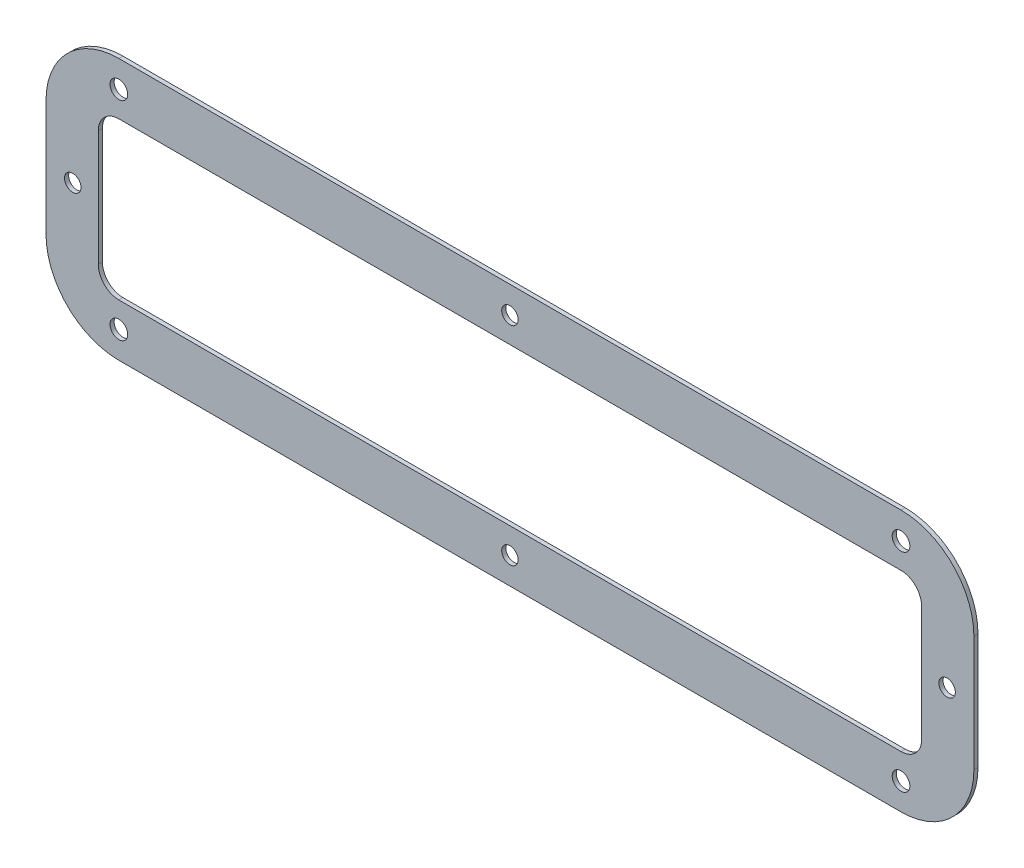
ISO-10303-21;
HEADER;
FILE_DESCRIPTION(('STEP AP214'),'2;1');
FILE_NAME('part.step','',(''),(''),'','','');
FILE_SCHEMA(('AUTOMOTIVE_DESIGN { 1 0 10303 214 1 1 1 1 }'));
ENDSEC;
DATA;
#1=APPLICATION_CONTEXT('core data for automotive mechanical design processes');
#2=APPLICATION_PROTOCOL_DEFINITION('international standard','automotive_design',2000,#1);
#3=PRODUCT_CONTEXT('',#1,'mechanical');
#4=PRODUCT('Part','Part','',(#3));
#5=PRODUCT_RELATED_PRODUCT_CATEGORY('part','',(#4));
#6=PRODUCT_DEFINITION_FORMATION('','',#4);
#7=PRODUCT_DEFINITION_CONTEXT('part definition',#1,'design');
#8=PRODUCT_DEFINITION('design','',#6,#7);
#9=PRODUCT_DEFINITION_SHAPE('','',#8);
#10=(LENGTH_UNIT() NAMED_UNIT(*) SI_UNIT(.MILLI.,.METRE.));
#11=(NAMED_UNIT(*) PLANE_ANGLE_UNIT() SI_UNIT($,.RADIAN.));
#12=(NAMED_UNIT(*) SI_UNIT($,.STERADIAN.) SOLID_ANGLE_UNIT());
#13=UNCERTAINTY_MEASURE_WITH_UNIT(LENGTH_MEASURE(1.E-05),#10,'distance_accuracy_value','');
#14=(GEOMETRIC_REPRESENTATION_CONTEXT(3) GLOBAL_UNCERTAINTY_ASSIGNED_CONTEXT((#13)) GLOBAL_UNIT_ASSIGNED_CONTEXT((#10,
#11,#12)) REPRESENTATION_CONTEXT('',''));
#15=CARTESIAN_POINT('',(0.,0.,0.));
#16=DIRECTION('',(0.,0.,1.));
#17=DIRECTION('',(1.,0.,0.));
#18=AXIS2_PLACEMENT_3D('',#15,#16,#17);
#19=CARTESIAN_POINT('',(95.,14.05,1.));
#20=DIRECTION('',(0.,0.,-1.));
#21=DIRECTION('',(-1.,0.,0.));
#22=AXIS2_PLACEMENT_3D('',#19,#20,#21);
#23=PLANE('',#22);
#24=CARTESIAN_POINT('',(95.,14.05,1.));
#25=DIRECTION('',(0.,0.,1.));
#26=DIRECTION('',(-1.,0.,0.));
#27=AXIS2_PLACEMENT_3D('',#24,#25,#26);
#28=CIRCLE('',#27,17.7);
#29=CARTESIAN_POINT('',(112.7,14.0499999999999,1.));
#30=VERTEX_POINT('',#29);
#31=CARTESIAN_POINT('',(94.9999999999999,31.75,1.));
#32=VERTEX_POINT('',#31);
#33=EDGE_CURVE('E217',#30,#32,#28,.T.);
#34=ORIENTED_EDGE('',*,*,#33,.T.);
#35=DIRECTION('',(-1.,0.,0.));
#36=VECTOR('',#35,1.);
#37=CARTESIAN_POINT('',(-94.9999999999999,31.75,1.));
#38=LINE('',#37,#36);
#39=CARTESIAN_POINT('',(-94.9999999999999,31.75,1.));
#40=VERTEX_POINT('',#39);
#41=EDGE_CURVE('E220',#32,#40,#38,.T.);
#42=ORIENTED_EDGE('',*,*,#41,.T.);
#43=CARTESIAN_POINT('',(-95.,14.05,1.));
#44=DIRECTION('',(0.,0.,1.));
#45=DIRECTION('',(-1.,0.,0.));
#46=AXIS2_PLACEMENT_3D('',#43,#44,#45);
#47=CIRCLE('',#46,17.7);
#48=CARTESIAN_POINT('',(-112.7,14.0499999999999,1.));
#49=VERTEX_POINT('',#48);
#50=EDGE_CURVE('E223',#40,#49,#47,.T.);
#51=ORIENTED_EDGE('',*,*,#50,.T.);
#52=DIRECTION('',(0.,-1.,0.));
#53=VECTOR('',#52,1.);
#54=CARTESIAN_POINT('',(-112.7,-14.0499999999999,1.));
#55=LINE('',#54,#53);
#56=CARTESIAN_POINT('',(-112.7,-14.0499999999999,1.));
#57=VERTEX_POINT('',#56);
#58=EDGE_CURVE('E225',#49,#57,#55,.T.);
#59=ORIENTED_EDGE('',*,*,#58,.T.);
#60=CARTESIAN_POINT('',(-95.,-14.05,1.));
#61=DIRECTION('',(0.,0.,1.));
#62=DIRECTION('',(-1.,0.,0.));
#63=AXIS2_PLACEMENT_3D('',#60,#61,#62);
#64=CIRCLE('',#63,17.7);
#65=CARTESIAN_POINT('',(-94.9999999999999,-31.75,1.));
#66=VERTEX_POINT('',#65);
#67=EDGE_CURVE('E227',#57,#66,#64,.T.);
#68=ORIENTED_EDGE('',*,*,#67,.T.);
#69=DIRECTION('',(1.,0.,0.));
#70=VECTOR('',#69,1.);
#71=CARTESIAN_POINT('',(-94.9999999999999,-31.75,1.));
#72=LINE('',#71,#70);
#73=CARTESIAN_POINT('',(94.9999999999999,-31.75,1.));
#74=VERTEX_POINT('',#73);
#75=EDGE_CURVE('E229',#66,#74,#72,.T.);
#76=ORIENTED_EDGE('',*,*,#75,.T.);
#77=CARTESIAN_POINT('',(95.,-14.05,1.));
#78=DIRECTION('',(0.,0.,1.));
#79=DIRECTION('',(1.,0.,0.));
#80=AXIS2_PLACEMENT_3D('',#77,#78,#79);
#81=CIRCLE('',#80,17.7);
#82=CARTESIAN_POINT('',(112.7,-14.05,1.));
#83=VERTEX_POINT('',#82);
#84=EDGE_CURVE('E231',#74,#83,#81,.T.);
#85=ORIENTED_EDGE('',*,*,#84,.T.);
#86=DIRECTION('',(0.,1.,0.));
#87=VECTOR('',#86,1.);
#88=CARTESIAN_POINT('',(112.7,-14.0499999999999,1.));
#89=LINE('',#88,#87);
#90=EDGE_CURVE('E233',#83,#30,#89,.T.);
#91=ORIENTED_EDGE('',*,*,#90,.T.);
#92=EDGE_LOOP('',(#34,#42,#51,#59,#68,#76,#85,#91));
#93=FACE_BOUND('',#92,.T.);
#94=CARTESIAN_POINT('',(95.0000000000001,14.05,1.));
#95=DIRECTION('',(0.,0.,1.));
#96=DIRECTION('',(-1.,0.,0.));
#97=AXIS2_PLACEMENT_3D('',#94,#95,#96);
#98=CIRCLE('',#97,5.);
#99=CARTESIAN_POINT('',(100.,14.05,1.));
#100=VERTEX_POINT('',#99);
#101=CARTESIAN_POINT('',(95.,19.05,1.));
#102=VERTEX_POINT('',#101);
#103=EDGE_CURVE('E149',#100,#102,#98,.T.);
#104=ORIENTED_EDGE('',*,*,#103,.F.);
#105=DIRECTION('',(0.,1.,0.));
#106=VECTOR('',#105,1.);
#107=CARTESIAN_POINT('',(100.,-14.05,1.));
#108=LINE('',#107,#106);
#109=CARTESIAN_POINT('',(100.,-14.05,1.));
#110=VERTEX_POINT('',#109);
#111=EDGE_CURVE('E184',#110,#100,#108,.T.);
#112=ORIENTED_EDGE('',*,*,#111,.F.);
#113=CARTESIAN_POINT('',(95.0000000000001,-14.05,1.));
#114=DIRECTION('',(0.,0.,1.));
#115=DIRECTION('',(1.,0.,0.));
#116=AXIS2_PLACEMENT_3D('',#113,#114,#115);
#117=CIRCLE('',#116,5.);
#118=CARTESIAN_POINT('',(95.,-19.05,1.));
#119=VERTEX_POINT('',#118);
#120=EDGE_CURVE('E182',#119,#110,#117,.T.);
#121=ORIENTED_EDGE('',*,*,#120,.F.);
#122=DIRECTION('',(1.,0.,0.));
#123=VECTOR('',#122,1.);
#124=CARTESIAN_POINT('',(-94.9999999999999,-19.05,1.));
#125=LINE('',#124,#123);
#126=CARTESIAN_POINT('',(-94.9999999999999,-19.05,1.));
#127=VERTEX_POINT('',#126);
#128=EDGE_CURVE('E180',#127,#119,#125,.T.);
#129=ORIENTED_EDGE('',*,*,#128,.F.);
#130=CARTESIAN_POINT('',(-94.9999999999999,-14.05,1.));
#131=DIRECTION('',(0.,0.,1.));
#132=DIRECTION('',(-1.,0.,0.));
#133=AXIS2_PLACEMENT_3D('',#130,#131,#132);
#134=CIRCLE('',#133,5.);
#135=CARTESIAN_POINT('',(-99.9999999999999,-14.05,1.));
#136=VERTEX_POINT('',#135);
#137=EDGE_CURVE('E178',#136,#127,#134,.T.);
#138=ORIENTED_EDGE('',*,*,#137,.F.);
#139=DIRECTION('',(0.,-1.,0.));
#140=VECTOR('',#139,1.);
#141=CARTESIAN_POINT('',(-99.9999999999999,-14.05,1.));
#142=LINE('',#141,#140);
#143=CARTESIAN_POINT('',(-99.9999999999999,14.05,1.));
#144=VERTEX_POINT('',#143);
#145=EDGE_CURVE('E173',#144,#136,#142,.T.);
#146=ORIENTED_EDGE('',*,*,#145,.F.);
#147=CARTESIAN_POINT('',(-94.9999999999999,14.05,1.));
#148=DIRECTION('',(0.,0.,1.));
#149=DIRECTION('',(-1.,0.,0.));
#150=AXIS2_PLACEMENT_3D('',#147,#148,#149);
#151=CIRCLE('',#150,5.);
#152=CARTESIAN_POINT('',(-94.9999999999999,19.05,1.));
#153=VERTEX_POINT('',#152);
#154=EDGE_CURVE('E171',#153,#144,#151,.T.);
#155=ORIENTED_EDGE('',*,*,#154,.F.);
#156=DIRECTION('',(-1.,0.,0.));
#157=VECTOR('',#156,1.);
#158=CARTESIAN_POINT('',(-94.9999999999999,19.05,1.));
#159=LINE('',#158,#157);
#160=EDGE_CURVE('E157',#102,#153,#159,.T.);
#161=ORIENTED_EDGE('',*,*,#160,.F.);
#162=EDGE_LOOP('',(#104,#112,#121,#129,#138,#146,#155,#161));
#163=FACE_BOUND('',#162,.T.);
#164=CARTESIAN_POINT('',(-106.2,0.,1.));
#165=DIRECTION('',(0.,0.,1.));
#166=DIRECTION('',(1.,0.,0.));
#167=AXIS2_PLACEMENT_3D('',#164,#165,#166);
#168=CIRCLE('',#167,2.);
#169=CARTESIAN_POINT('',(-104.2,0.,1.));
#170=VERTEX_POINT('',#169);
#171=EDGE_CURVE('E187',#170,#170,#168,.T.);
#172=ORIENTED_EDGE('',*,*,#171,.F.);
#173=EDGE_LOOP('',(#172));
#174=FACE_BOUND('',#173,.T.);
#175=CARTESIAN_POINT('',(0.,25.25,1.));
#176=DIRECTION('',(0.,0.,1.));
#177=DIRECTION('',(1.,0.,0.));
#178=AXIS2_PLACEMENT_3D('',#175,#176,#177);
#179=CIRCLE('',#178,2.);
#180=CARTESIAN_POINT('',(1.99999999999994,25.25,1.));
#181=VERTEX_POINT('',#180);
#182=EDGE_CURVE('E435',#181,#181,#179,.T.);
#183=ORIENTED_EDGE('',*,*,#182,.F.);
#184=EDGE_LOOP('',(#183));
#185=FACE_BOUND('',#184,.T.);
#186=CARTESIAN_POINT('',(-95.0000000000001,25.25,1.));
#187=DIRECTION('',(0.,0.,1.));
#188=DIRECTION('',(1.,0.,0.));
#189=AXIS2_PLACEMENT_3D('',#186,#187,#188);
#190=CIRCLE('',#189,2.14689788647293);
#191=CARTESIAN_POINT('',(-92.8531021135271,25.25,1.));
#192=VERTEX_POINT('',#191);
#193=EDGE_CURVE('E429',#192,#192,#190,.T.);
#194=ORIENTED_EDGE('',*,*,#193,.F.);
#195=EDGE_LOOP('',(#194));
#196=FACE_BOUND('',#195,.T.);
#197=CARTESIAN_POINT('',(-95.0000000000001,-25.25,1.));
#198=DIRECTION('',(0.,0.,1.));
#199=DIRECTION('',(-1.,0.,0.));
#200=AXIS2_PLACEMENT_3D('',#197,#198,#199);
#201=CIRCLE('',#200,2.14689788647293);
#202=CARTESIAN_POINT('',(-97.146897886473,-25.25,1.));
#203=VERTEX_POINT('',#202);
#204=EDGE_CURVE('E423',#203,#203,#201,.T.);
#205=ORIENTED_EDGE('',*,*,#204,.F.);
#206=EDGE_LOOP('',(#205));
#207=FACE_BOUND('',#206,.T.);
#208=CARTESIAN_POINT('',(0.,-25.25,1.));
#209=DIRECTION('',(0.,0.,1.));
#210=DIRECTION('',(-1.,0.,0.));
#211=AXIS2_PLACEMENT_3D('',#208,#209,#210);
#212=CIRCLE('',#211,2.);
#213=CARTESIAN_POINT('',(-2.00000000000007,-25.25,1.));
#214=VERTEX_POINT('',#213);
#215=EDGE_CURVE('E417',#214,#214,#212,.T.);
#216=ORIENTED_EDGE('',*,*,#215,.F.);
#217=EDGE_LOOP('',(#216));
#218=FACE_BOUND('',#217,.T.);
#219=CARTESIAN_POINT('',(94.9999999999999,-25.2500000000001,1.));
#220=DIRECTION('',(0.,0.,1.));
#221=DIRECTION('',(1.,0.,0.));
#222=AXIS2_PLACEMENT_3D('',#219,#220,#221);
#223=CIRCLE('',#222,2.14689788647293);
#224=CARTESIAN_POINT('',(97.1468978864728,-25.2500000000001,1.));
#225=VERTEX_POINT('',#224);
#226=EDGE_CURVE('E411',#225,#225,#223,.T.);
#227=ORIENTED_EDGE('',*,*,#226,.F.);
#228=EDGE_LOOP('',(#227));
#229=FACE_BOUND('',#228,.T.);
#230=CARTESIAN_POINT('',(106.2,0.,1.));
#231=DIRECTION('',(0.,0.,1.));
#232=DIRECTION('',(-1.,0.,0.));
#233=AXIS2_PLACEMENT_3D('',#230,#231,#232);
#234=CIRCLE('',#233,2.);
#235=CARTESIAN_POINT('',(104.2,0.,1.));
#236=VERTEX_POINT('',#235);
#237=EDGE_CURVE('E405',#236,#236,#234,.T.);
#238=ORIENTED_EDGE('',*,*,#237,.F.);
#239=EDGE_LOOP('',(#238));
#240=FACE_BOUND('',#239,.T.);
#241=CARTESIAN_POINT('',(95.,25.2499999999999,1.));
#242=DIRECTION('',(0.,0.,1.));
#243=DIRECTION('',(-1.,0.,0.));
#244=AXIS2_PLACEMENT_3D('',#241,#242,#243);
#245=CIRCLE('',#244,2.14689788647293);
#246=CARTESIAN_POINT('',(92.853102113527,25.2499999999999,1.));
#247=VERTEX_POINT('',#246);
#248=EDGE_CURVE('E396',#247,#247,#245,.T.);
#249=ORIENTED_EDGE('',*,*,#248,.F.);
#250=EDGE_LOOP('',(#249));
#251=FACE_BOUND('',#250,.T.);
#252=ADVANCED_FACE('F36',(#93,#163,#174,#185,#196,#207,#218,#229,#240,#251),#23,.F.);
#253=CARTESIAN_POINT('',(95.,14.05,0.));
#254=DIRECTION('',(0.,0.,-1.));
#255=DIRECTION('',(-1.,0.,0.));
#256=AXIS2_PLACEMENT_3D('',#253,#254,#255);
#257=PLANE('',#256);
#258=CARTESIAN_POINT('',(106.2,0.,0.));
#259=DIRECTION('',(0.,0.,1.));
#260=DIRECTION('',(-1.,0.,0.));
#261=AXIS2_PLACEMENT_3D('',#258,#259,#260);
#262=CIRCLE('',#261,2.);
#263=CARTESIAN_POINT('',(104.2,0.,0.));
#264=VERTEX_POINT('',#263);
#265=EDGE_CURVE('E402',#264,#264,#262,.T.);
#266=ORIENTED_EDGE('',*,*,#265,.T.);
#267=EDGE_LOOP('',(#266));
#268=FACE_BOUND('',#267,.T.);
#269=CARTESIAN_POINT('',(0.,-25.25,0.));
#270=DIRECTION('',(0.,0.,1.));
#271=DIRECTION('',(-1.,0.,0.));
#272=AXIS2_PLACEMENT_3D('',#269,#270,#271);
#273=CIRCLE('',#272,2.);
#274=CARTESIAN_POINT('',(-2.00000000000007,-25.25,0.));
#275=VERTEX_POINT('',#274);
#276=EDGE_CURVE('E414',#275,#275,#273,.T.);
#277=ORIENTED_EDGE('',*,*,#276,.T.);
#278=EDGE_LOOP('',(#277));
#279=FACE_BOUND('',#278,.T.);
#280=CARTESIAN_POINT('',(-95.0000000000001,25.25,0.));
#281=DIRECTION('',(0.,0.,1.));
#282=DIRECTION('',(1.,0.,0.));
#283=AXIS2_PLACEMENT_3D('',#280,#281,#282);
#284=CIRCLE('',#283,2.14689788647293);
#285=CARTESIAN_POINT('',(-92.8531021135271,25.25,0.));
#286=VERTEX_POINT('',#285);
#287=EDGE_CURVE('E426',#286,#286,#284,.T.);
#288=ORIENTED_EDGE('',*,*,#287,.T.);
#289=EDGE_LOOP('',(#288));
#290=FACE_BOUND('',#289,.T.);
#291=CARTESIAN_POINT('',(-106.2,0.,0.));
#292=DIRECTION('',(0.,0.,1.));
#293=DIRECTION('',(1.,0.,0.));
#294=AXIS2_PLACEMENT_3D('',#291,#292,#293);
#295=CIRCLE('',#294,2.);
#296=CARTESIAN_POINT('',(-104.2,0.,0.));
#297=VERTEX_POINT('',#296);
#298=EDGE_CURVE('E438',#297,#297,#295,.T.);
#299=ORIENTED_EDGE('',*,*,#298,.T.);
#300=EDGE_LOOP('',(#299));
#301=FACE_BOUND('',#300,.T.);
#302=CARTESIAN_POINT('',(95.,14.05,0.));
#303=DIRECTION('',(0.,0.,1.));
#304=DIRECTION('',(-1.,0.,0.));
#305=AXIS2_PLACEMENT_3D('',#302,#303,#304);
#306=CIRCLE('',#305,17.7);
#307=CARTESIAN_POINT('',(112.7,14.0499999999999,0.));
#308=VERTEX_POINT('',#307);
#309=CARTESIAN_POINT('',(94.9999999999999,31.75,0.));
#310=VERTEX_POINT('',#309);
#311=EDGE_CURVE('E165',#308,#310,#306,.T.);
#312=ORIENTED_EDGE('',*,*,#311,.F.);
#313=DIRECTION('',(0.,1.,0.));
#314=VECTOR('',#313,1.);
#315=CARTESIAN_POINT('',(112.7,-14.0499999999999,0.));
#316=LINE('',#315,#314);
#317=CARTESIAN_POINT('',(112.7,-14.05,0.));
#318=VERTEX_POINT('',#317);
#319=EDGE_CURVE('E221',#318,#308,#316,.T.);
#320=ORIENTED_EDGE('',*,*,#319,.F.);
#321=CARTESIAN_POINT('',(95.,-14.05,0.));
#322=DIRECTION('',(0.,0.,1.));
#323=DIRECTION('',(1.,0.,0.));
#324=AXIS2_PLACEMENT_3D('',#321,#322,#323);
#325=CIRCLE('',#324,17.7);
#326=CARTESIAN_POINT('',(94.9999999999999,-31.75,0.));
#327=VERTEX_POINT('',#326);
#328=EDGE_CURVE('E248',#327,#318,#325,.T.);
#329=ORIENTED_EDGE('',*,*,#328,.F.);
#330=DIRECTION('',(1.,0.,0.));
#331=VECTOR('',#330,1.);
#332=CARTESIAN_POINT('',(-94.9999999999999,-31.75,0.));
#333=LINE('',#332,#331);
#334=CARTESIAN_POINT('',(-94.9999999999999,-31.75,0.));
#335=VERTEX_POINT('',#334);
#336=EDGE_CURVE('E246',#335,#327,#333,.T.);
#337=ORIENTED_EDGE('',*,*,#336,.F.);
#338=CARTESIAN_POINT('',(-95.,-14.05,0.));
#339=DIRECTION('',(0.,0.,1.));
#340=DIRECTION('',(-1.,0.,0.));
#341=AXIS2_PLACEMENT_3D('',#338,#339,#340);
#342=CIRCLE('',#341,17.7);
#343=CARTESIAN_POINT('',(-112.7,-14.0499999999999,0.));
#344=VERTEX_POINT('',#343);
#345=EDGE_CURVE('E244',#344,#335,#342,.T.);
#346=ORIENTED_EDGE('',*,*,#345,.F.);
#347=DIRECTION('',(0.,-1.,0.));
#348=VECTOR('',#347,1.);
#349=CARTESIAN_POINT('',(-112.7,-14.0499999999999,0.));
#350=LINE('',#349,#348);
#351=CARTESIAN_POINT('',(-112.7,14.0499999999999,0.));
#352=VERTEX_POINT('',#351);
#353=EDGE_CURVE('E242',#352,#344,#350,.T.);
#354=ORIENTED_EDGE('',*,*,#353,.F.);
#355=CARTESIAN_POINT('',(-95.,14.05,0.));
#356=DIRECTION('',(0.,0.,1.));
#357=DIRECTION('',(-1.,0.,0.));
#358=AXIS2_PLACEMENT_3D('',#355,#356,#357);
#359=CIRCLE('',#358,17.7);
#360=CARTESIAN_POINT('',(-94.9999999999999,31.75,0.));
#361=VERTEX_POINT('',#360);
#362=EDGE_CURVE('E240',#361,#352,#359,.T.);
#363=ORIENTED_EDGE('',*,*,#362,.F.);
#364=DIRECTION('',(-1.,0.,0.));
#365=VECTOR('',#364,1.);
#366=CARTESIAN_POINT('',(-94.9999999999999,31.75,0.));
#367=LINE('',#366,#365);
#368=EDGE_CURVE('E238',#310,#361,#367,.T.);
#369=ORIENTED_EDGE('',*,*,#368,.F.);
#370=EDGE_LOOP('',(#312,#320,#329,#337,#346,#354,#363,#369));
#371=FACE_BOUND('',#370,.T.);
#372=DIRECTION('',(0.,1.,0.));
#373=VECTOR('',#372,1.);
#374=CARTESIAN_POINT('',(100.,-14.05,0.));
#375=LINE('',#374,#373);
#376=CARTESIAN_POINT('',(100.,-14.05,0.));
#377=VERTEX_POINT('',#376);
#378=CARTESIAN_POINT('',(100.,14.05,0.));
#379=VERTEX_POINT('',#378);
#380=EDGE_CURVE('E158',#377,#379,#375,.T.);
#381=ORIENTED_EDGE('',*,*,#380,.T.);
#382=CARTESIAN_POINT('',(95.0000000000001,14.05,0.));
#383=DIRECTION('',(0.,0.,1.));
#384=DIRECTION('',(-1.,0.,0.));
#385=AXIS2_PLACEMENT_3D('',#382,#383,#384);
#386=CIRCLE('',#385,5.);
#387=CARTESIAN_POINT('',(95.,19.05,0.));
#388=VERTEX_POINT('',#387);
#389=EDGE_CURVE('E59',#379,#388,#386,.T.);
#390=ORIENTED_EDGE('',*,*,#389,.T.);
#391=DIRECTION('',(-1.,0.,0.));
#392=VECTOR('',#391,1.);
#393=CARTESIAN_POINT('',(-94.9999999999999,19.05,0.));
#394=LINE('',#393,#392);
#395=CARTESIAN_POINT('',(-94.9999999999999,19.05,0.));
#396=VERTEX_POINT('',#395);
#397=EDGE_CURVE('E164',#388,#396,#394,.T.);
#398=ORIENTED_EDGE('',*,*,#397,.T.);
#399=CARTESIAN_POINT('',(-94.9999999999999,14.05,0.));
#400=DIRECTION('',(0.,0.,1.));
#401=DIRECTION('',(-1.,0.,0.));
#402=AXIS2_PLACEMENT_3D('',#399,#400,#401);
#403=CIRCLE('',#402,5.);
#404=CARTESIAN_POINT('',(-99.9999999999999,14.05,0.));
#405=VERTEX_POINT('',#404);
#406=EDGE_CURVE('E189',#396,#405,#403,.T.);
#407=ORIENTED_EDGE('',*,*,#406,.T.);
#408=DIRECTION('',(0.,-1.,0.));
#409=VECTOR('',#408,1.);
#410=CARTESIAN_POINT('',(-99.9999999999999,-14.05,0.));
#411=LINE('',#410,#409);
#412=CARTESIAN_POINT('',(-99.9999999999999,-14.05,0.));
#413=VERTEX_POINT('',#412);
#414=EDGE_CURVE('E192',#405,#413,#411,.T.);
#415=ORIENTED_EDGE('',*,*,#414,.T.);
#416=CARTESIAN_POINT('',(-94.9999999999999,-14.05,0.));
#417=DIRECTION('',(0.,0.,1.));
#418=DIRECTION('',(-1.,0.,0.));
#419=AXIS2_PLACEMENT_3D('',#416,#417,#418);
#420=CIRCLE('',#419,5.);
#421=CARTESIAN_POINT('',(-94.9999999999999,-19.05,0.));
#422=VERTEX_POINT('',#421);
#423=EDGE_CURVE('E195',#413,#422,#420,.T.);
#424=ORIENTED_EDGE('',*,*,#423,.T.);
#425=DIRECTION('',(1.,0.,0.));
#426=VECTOR('',#425,1.);
#427=CARTESIAN_POINT('',(-94.9999999999999,-19.05,0.));
#428=LINE('',#427,#426);
#429=CARTESIAN_POINT('',(95.,-19.05,0.));
#430=VERTEX_POINT('',#429);
#431=EDGE_CURVE('E198',#422,#430,#428,.T.);
#432=ORIENTED_EDGE('',*,*,#431,.T.);
#433=CARTESIAN_POINT('',(95.0000000000001,-14.05,0.));
#434=DIRECTION('',(0.,0.,1.));
#435=DIRECTION('',(1.,0.,0.));
#436=AXIS2_PLACEMENT_3D('',#433,#434,#435);
#437=CIRCLE('',#436,5.);
#438=EDGE_CURVE('E201',#430,#377,#437,.T.);
#439=ORIENTED_EDGE('',*,*,#438,.T.);
#440=EDGE_LOOP('',(#381,#390,#398,#407,#415,#424,#432,#439));
#441=FACE_BOUND('',#440,.T.);
#442=CARTESIAN_POINT('',(0.,25.25,0.));
#443=DIRECTION('',(0.,0.,1.));
#444=DIRECTION('',(1.,0.,0.));
#445=AXIS2_PLACEMENT_3D('',#442,#443,#444);
#446=CIRCLE('',#445,2.);
#447=CARTESIAN_POINT('',(1.99999999999994,25.25,0.));
#448=VERTEX_POINT('',#447);
#449=EDGE_CURVE('E432',#448,#448,#446,.T.);
#450=ORIENTED_EDGE('',*,*,#449,.T.);
#451=EDGE_LOOP('',(#450));
#452=FACE_BOUND('',#451,.T.);
#453=CARTESIAN_POINT('',(-95.0000000000001,-25.25,0.));
#454=DIRECTION('',(0.,0.,1.));
#455=DIRECTION('',(-1.,0.,0.));
#456=AXIS2_PLACEMENT_3D('',#453,#454,#455);
#457=CIRCLE('',#456,2.14689788647293);
#458=CARTESIAN_POINT('',(-97.146897886473,-25.25,0.));
#459=VERTEX_POINT('',#458);
#460=EDGE_CURVE('E420',#459,#459,#457,.T.);
#461=ORIENTED_EDGE('',*,*,#460,.T.);
#462=EDGE_LOOP('',(#461));
#463=FACE_BOUND('',#462,.T.);
#464=CARTESIAN_POINT('',(94.9999999999999,-25.2500000000001,0.));
#465=DIRECTION('',(0.,0.,1.));
#466=DIRECTION('',(1.,0.,0.));
#467=AXIS2_PLACEMENT_3D('',#464,#465,#466);
#468=CIRCLE('',#467,2.14689788647293);
#469=CARTESIAN_POINT('',(97.1468978864728,-25.2500000000001,0.));
#470=VERTEX_POINT('',#469);
#471=EDGE_CURVE('E408',#470,#470,#468,.T.);
#472=ORIENTED_EDGE('',*,*,#471,.T.);
#473=EDGE_LOOP('',(#472));
#474=FACE_BOUND('',#473,.T.);
#475=CARTESIAN_POINT('',(95.,25.2499999999999,0.));
#476=DIRECTION('',(0.,0.,1.));
#477=DIRECTION('',(-1.,0.,0.));
#478=AXIS2_PLACEMENT_3D('',#475,#476,#477);
#479=CIRCLE('',#478,2.14689788647293);
#480=CARTESIAN_POINT('',(92.853102113527,25.2499999999999,0.));
#481=VERTEX_POINT('',#480);
#482=EDGE_CURVE('E399',#481,#481,#479,.T.);
#483=ORIENTED_EDGE('',*,*,#482,.T.);
#484=EDGE_LOOP('',(#483));
#485=FACE_BOUND('',#484,.T.);
#486=ADVANCED_FACE('F278',(#268,#279,#290,#301,#371,#441,#452,#463,#474,#485),#257,.T.);
#487=CARTESIAN_POINT('',(95.,14.05,1.));
#488=DIRECTION('',(0.,0.,-1.));
#489=DIRECTION('',(-1.,0.,0.));
#490=AXIS2_PLACEMENT_3D('',#487,#488,#489);
#491=CYLINDRICAL_SURFACE('',#490,17.7);
#492=ORIENTED_EDGE('',*,*,#311,.T.);
#493=DIRECTION('',(0.,0.,-1.));
#494=VECTOR('',#493,1.);
#495=CARTESIAN_POINT('',(94.9999999999999,31.75,1.));
#496=LINE('',#495,#494);
#497=EDGE_CURVE('E11',#32,#310,#496,.T.);
#498=ORIENTED_EDGE('',*,*,#497,.F.);
#499=ORIENTED_EDGE('',*,*,#33,.F.);
#500=DIRECTION('',(0.,0.,-1.));
#501=VECTOR('',#500,1.);
#502=CARTESIAN_POINT('',(112.7,14.0499999999999,1.));
#503=LINE('',#502,#501);
#504=EDGE_CURVE('E235',#30,#308,#503,.T.);
#505=ORIENTED_EDGE('',*,*,#504,.T.);
#506=EDGE_LOOP('',(#492,#498,#499,#505));
#507=FACE_BOUND('',#506,.T.);
#508=ADVANCED_FACE('F38',(#507),#491,.T.);
#509=CARTESIAN_POINT('',(-94.9999999999999,31.75,1.));
#510=DIRECTION('',(0.,-1.,0.));
#511=DIRECTION('',(0.,0.,-1.));
#512=AXIS2_PLACEMENT_3D('',#509,#510,#511);
#513=PLANE('',#512);
#514=ORIENTED_EDGE('',*,*,#368,.T.);
#515=DIRECTION('',(0.,0.,-1.));
#516=VECTOR('',#515,1.);
#517=CARTESIAN_POINT('',(-94.9999999999999,31.75,1.));
#518=LINE('',#517,#516);
#519=EDGE_CURVE('E44',#40,#361,#518,.T.);
#520=ORIENTED_EDGE('',*,*,#519,.F.);
#521=ORIENTED_EDGE('',*,*,#41,.F.);
#522=ORIENTED_EDGE('',*,*,#497,.T.);
#523=EDGE_LOOP('',(#514,#520,#521,#522));
#524=FACE_BOUND('',#523,.T.);
#525=ADVANCED_FACE('F295',(#524),#513,.F.);
#526=CARTESIAN_POINT('',(-95.,14.05,1.));
#527=DIRECTION('',(0.,0.,-1.));
#528=DIRECTION('',(-1.,0.,0.));
#529=AXIS2_PLACEMENT_3D('',#526,#527,#528);
#530=CYLINDRICAL_SURFACE('',#529,17.7);
#531=ORIENTED_EDGE('',*,*,#362,.T.);
#532=DIRECTION('',(0.,0.,-1.));
#533=VECTOR('',#532,1.);
#534=CARTESIAN_POINT('',(-112.7,14.0499999999999,1.));
#535=LINE('',#534,#533);
#536=EDGE_CURVE('E265',#49,#352,#535,.T.);
#537=ORIENTED_EDGE('',*,*,#536,.F.);
#538=ORIENTED_EDGE('',*,*,#50,.F.);
#539=ORIENTED_EDGE('',*,*,#519,.T.);
#540=EDGE_LOOP('',(#531,#537,#538,#539));
#541=FACE_BOUND('',#540,.T.);
#542=ADVANCED_FACE('F272',(#541),#530,.T.);
#543=CARTESIAN_POINT('',(-112.7,-14.0499999999999,1.));
#544=DIRECTION('',(1.,0.,0.));
#545=DIRECTION('',(0.,0.,-1.));
#546=AXIS2_PLACEMENT_3D('',#543,#544,#545);
#547=PLANE('',#546);
#548=ORIENTED_EDGE('',*,*,#353,.T.);
#549=DIRECTION('',(0.,0.,-1.));
#550=VECTOR('',#549,1.);
#551=CARTESIAN_POINT('',(-112.7,-14.0499999999999,1.));
#552=LINE('',#551,#550);
#553=EDGE_CURVE('E262',#57,#344,#552,.T.);
#554=ORIENTED_EDGE('',*,*,#553,.F.);
#555=ORIENTED_EDGE('',*,*,#58,.F.);
#556=ORIENTED_EDGE('',*,*,#536,.T.);
#557=EDGE_LOOP('',(#548,#554,#555,#556));
#558=FACE_BOUND('',#557,.T.);
#559=ADVANCED_FACE('F284',(#558),#547,.F.);
#560=CARTESIAN_POINT('',(-95.,-14.05,1.));
#561=DIRECTION('',(0.,0.,-1.));
#562=DIRECTION('',(-1.,0.,0.));
#563=AXIS2_PLACEMENT_3D('',#560,#561,#562);
#564=CYLINDRICAL_SURFACE('',#563,17.7);
#565=ORIENTED_EDGE('',*,*,#345,.T.);
#566=DIRECTION('',(0.,0.,-1.));
#567=VECTOR('',#566,1.);
#568=CARTESIAN_POINT('',(-94.9999999999999,-31.75,1.));
#569=LINE('',#568,#567);
#570=EDGE_CURVE('E259',#66,#335,#569,.T.);
#571=ORIENTED_EDGE('',*,*,#570,.F.);
#572=ORIENTED_EDGE('',*,*,#67,.F.);
#573=ORIENTED_EDGE('',*,*,#553,.T.);
#574=EDGE_LOOP('',(#565,#571,#572,#573));
#575=FACE_BOUND('',#574,.T.);
#576=ADVANCED_FACE('F288',(#575),#564,.T.);
#577=CARTESIAN_POINT('',(-94.9999999999999,-31.75,1.));
#578=DIRECTION('',(0.,1.,0.));
#579=DIRECTION('',(0.,0.,1.));
#580=AXIS2_PLACEMENT_3D('',#577,#578,#579);
#581=PLANE('',#580);
#582=ORIENTED_EDGE('',*,*,#336,.T.);
#583=DIRECTION('',(0.,0.,-1.));
#584=VECTOR('',#583,1.);
#585=CARTESIAN_POINT('',(94.9999999999999,-31.75,1.));
#586=LINE('',#585,#584);
#587=EDGE_CURVE('E256',#74,#327,#586,.T.);
#588=ORIENTED_EDGE('',*,*,#587,.F.);
#589=ORIENTED_EDGE('',*,*,#75,.F.);
#590=ORIENTED_EDGE('',*,*,#570,.T.);
#591=EDGE_LOOP('',(#582,#588,#589,#590));
#592=FACE_BOUND('',#591,.T.);
#593=ADVANCED_FACE('F308',(#592),#581,.F.);
#594=CARTESIAN_POINT('',(95.,-14.05,1.));
#595=DIRECTION('',(0.,0.,-1.));
#596=DIRECTION('',(-1.,0.,0.));
#597=AXIS2_PLACEMENT_3D('',#594,#595,#596);
#598=CYLINDRICAL_SURFACE('',#597,17.7);
#599=ORIENTED_EDGE('',*,*,#328,.T.);
#600=DIRECTION('',(0.,0.,-1.));
#601=VECTOR('',#600,1.);
#602=CARTESIAN_POINT('',(112.7,-14.05,1.));
#603=LINE('',#602,#601);
#604=EDGE_CURVE('E253',#83,#318,#603,.T.);
#605=ORIENTED_EDGE('',*,*,#604,.F.);
#606=ORIENTED_EDGE('',*,*,#84,.F.);
#607=ORIENTED_EDGE('',*,*,#587,.T.);
#608=EDGE_LOOP('',(#599,#605,#606,#607));
#609=FACE_BOUND('',#608,.T.);
#610=ADVANCED_FACE('F306',(#609),#598,.T.);
#611=CARTESIAN_POINT('',(112.7,-14.0499999999999,1.));
#612=DIRECTION('',(-1.,0.,0.));
#613=DIRECTION('',(0.,0.,1.));
#614=AXIS2_PLACEMENT_3D('',#611,#612,#613);
#615=PLANE('',#614);
#616=ORIENTED_EDGE('',*,*,#319,.T.);
#617=ORIENTED_EDGE('',*,*,#504,.F.);
#618=ORIENTED_EDGE('',*,*,#90,.F.);
#619=ORIENTED_EDGE('',*,*,#604,.T.);
#620=EDGE_LOOP('',(#616,#617,#618,#619));
#621=FACE_BOUND('',#620,.T.);
#622=ADVANCED_FACE('F301',(#621),#615,.F.);
#623=CARTESIAN_POINT('',(95.0000000000001,14.05,1.));
#624=DIRECTION('',(0.,0.,-1.));
#625=DIRECTION('',(-1.,0.,0.));
#626=AXIS2_PLACEMENT_3D('',#623,#624,#625);
#627=CYLINDRICAL_SURFACE('',#626,5.);
#628=ORIENTED_EDGE('',*,*,#389,.F.);
#629=DIRECTION('',(0.,0.,-1.));
#630=VECTOR('',#629,1.);
#631=CARTESIAN_POINT('',(100.,14.05,1.));
#632=LINE('',#631,#630);
#633=EDGE_CURVE('E153',#100,#379,#632,.T.);
#634=ORIENTED_EDGE('',*,*,#633,.F.);
#635=ORIENTED_EDGE('',*,*,#103,.T.);
#636=DIRECTION('',(0.,0.,-1.));
#637=VECTOR('',#636,1.);
#638=CARTESIAN_POINT('',(95.,19.05,1.));
#639=LINE('',#638,#637);
#640=EDGE_CURVE('E152',#102,#388,#639,.T.);
#641=ORIENTED_EDGE('',*,*,#640,.T.);
#642=EDGE_LOOP('',(#628,#634,#635,#641));
#643=FACE_BOUND('',#642,.T.);
#644=ADVANCED_FACE('F151',(#643),#627,.F.);
#645=CARTESIAN_POINT('',(-94.9999999999999,19.05,1.));
#646=DIRECTION('',(0.,-1.,0.));
#647=DIRECTION('',(0.,0.,-1.));
#648=AXIS2_PLACEMENT_3D('',#645,#646,#647);
#649=PLANE('',#648);
#650=ORIENTED_EDGE('',*,*,#397,.F.);
#651=ORIENTED_EDGE('',*,*,#640,.F.);
#652=ORIENTED_EDGE('',*,*,#160,.T.);
#653=DIRECTION('',(0.,0.,-1.));
#654=VECTOR('',#653,1.);
#655=CARTESIAN_POINT('',(-94.9999999999999,19.05,1.));
#656=LINE('',#655,#654);
#657=EDGE_CURVE('E166',#153,#396,#656,.T.);
#658=ORIENTED_EDGE('',*,*,#657,.T.);
#659=EDGE_LOOP('',(#650,#651,#652,#658));
#660=FACE_BOUND('',#659,.T.);
#661=ADVANCED_FACE('F161',(#660),#649,.T.);
#662=CARTESIAN_POINT('',(-94.9999999999999,14.05,1.));
#663=DIRECTION('',(0.,0.,-1.));
#664=DIRECTION('',(-1.,0.,0.));
#665=AXIS2_PLACEMENT_3D('',#662,#663,#664);
#666=CYLINDRICAL_SURFACE('',#665,5.);
#667=ORIENTED_EDGE('',*,*,#406,.F.);
#668=ORIENTED_EDGE('',*,*,#657,.F.);
#669=ORIENTED_EDGE('',*,*,#154,.T.);
#670=DIRECTION('',(0.,0.,-1.));
#671=VECTOR('',#670,1.);
#672=CARTESIAN_POINT('',(-99.9999999999999,14.05,1.));
#673=LINE('',#672,#671);
#674=EDGE_CURVE('E214',#144,#405,#673,.T.);
#675=ORIENTED_EDGE('',*,*,#674,.T.);
#676=EDGE_LOOP('',(#667,#668,#669,#675));
#677=FACE_BOUND('',#676,.T.);
#678=ADVANCED_FACE('F334',(#677),#666,.F.);
#679=CARTESIAN_POINT('',(-99.9999999999999,-14.05,1.));
#680=DIRECTION('',(1.,0.,0.));
#681=DIRECTION('',(0.,0.,-1.));
#682=AXIS2_PLACEMENT_3D('',#679,#680,#681);
#683=PLANE('',#682);
#684=ORIENTED_EDGE('',*,*,#414,.F.);
#685=ORIENTED_EDGE('',*,*,#674,.F.);
#686=ORIENTED_EDGE('',*,*,#145,.T.);
#687=DIRECTION('',(0.,0.,-1.));
#688=VECTOR('',#687,1.);
#689=CARTESIAN_POINT('',(-99.9999999999999,-14.05,1.));
#690=LINE('',#689,#688);
#691=EDGE_CURVE('E212',#136,#413,#690,.T.);
#692=ORIENTED_EDGE('',*,*,#691,.T.);
#693=EDGE_LOOP('',(#684,#685,#686,#692));
#694=FACE_BOUND('',#693,.T.);
#695=ADVANCED_FACE('F338',(#694),#683,.T.);
#696=CARTESIAN_POINT('',(-94.9999999999999,-14.05,1.));
#697=DIRECTION('',(0.,0.,-1.));
#698=DIRECTION('',(-1.,0.,0.));
#699=AXIS2_PLACEMENT_3D('',#696,#697,#698);
#700=CYLINDRICAL_SURFACE('',#699,5.);
#701=ORIENTED_EDGE('',*,*,#423,.F.);
#702=ORIENTED_EDGE('',*,*,#691,.F.);
#703=ORIENTED_EDGE('',*,*,#137,.T.);
#704=DIRECTION('',(0.,0.,-1.));
#705=VECTOR('',#704,1.);
#706=CARTESIAN_POINT('',(-94.9999999999999,-19.05,1.));
#707=LINE('',#706,#705);
#708=EDGE_CURVE('E210',#127,#422,#707,.T.);
#709=ORIENTED_EDGE('',*,*,#708,.T.);
#710=EDGE_LOOP('',(#701,#702,#703,#709));
#711=FACE_BOUND('',#710,.T.);
#712=ADVANCED_FACE('F344',(#711),#700,.F.);
#713=CARTESIAN_POINT('',(-94.9999999999999,-19.05,1.));
#714=DIRECTION('',(0.,1.,0.));
#715=DIRECTION('',(0.,0.,1.));
#716=AXIS2_PLACEMENT_3D('',#713,#714,#715);
#717=PLANE('',#716);
#718=ORIENTED_EDGE('',*,*,#431,.F.);
#719=ORIENTED_EDGE('',*,*,#708,.F.);
#720=ORIENTED_EDGE('',*,*,#128,.T.);
#721=DIRECTION('',(0.,0.,-1.));
#722=VECTOR('',#721,1.);
#723=CARTESIAN_POINT('',(95.,-19.05,1.));
#724=LINE('',#723,#722);
#725=EDGE_CURVE('E208',#119,#430,#724,.T.);
#726=ORIENTED_EDGE('',*,*,#725,.T.);
#727=EDGE_LOOP('',(#718,#719,#720,#726));
#728=FACE_BOUND('',#727,.T.);
#729=ADVANCED_FACE('F348',(#728),#717,.T.);
#730=CARTESIAN_POINT('',(95.0000000000001,-14.05,1.));
#731=DIRECTION('',(0.,0.,-1.));
#732=DIRECTION('',(-1.,0.,0.));
#733=AXIS2_PLACEMENT_3D('',#730,#731,#732);
#734=CYLINDRICAL_SURFACE('',#733,5.);
#735=ORIENTED_EDGE('',*,*,#438,.F.);
#736=ORIENTED_EDGE('',*,*,#725,.F.);
#737=ORIENTED_EDGE('',*,*,#120,.T.);
#738=DIRECTION('',(0.,0.,-1.));
#739=VECTOR('',#738,1.);
#740=CARTESIAN_POINT('',(100.,-14.05,1.));
#741=LINE('',#740,#739);
#742=EDGE_CURVE('E51',#110,#377,#741,.T.);
#743=ORIENTED_EDGE('',*,*,#742,.T.);
#744=EDGE_LOOP('',(#735,#736,#737,#743));
#745=FACE_BOUND('',#744,.T.);
#746=ADVANCED_FACE('F352',(#745),#734,.F.);
#747=CARTESIAN_POINT('',(100.,-14.05,1.));
#748=DIRECTION('',(-1.,0.,0.));
#749=DIRECTION('',(0.,0.,1.));
#750=AXIS2_PLACEMENT_3D('',#747,#748,#749);
#751=PLANE('',#750);
#752=ORIENTED_EDGE('',*,*,#380,.F.);
#753=ORIENTED_EDGE('',*,*,#742,.F.);
#754=ORIENTED_EDGE('',*,*,#111,.T.);
#755=ORIENTED_EDGE('',*,*,#633,.T.);
#756=EDGE_LOOP('',(#752,#753,#754,#755));
#757=FACE_BOUND('',#756,.T.);
#758=ADVANCED_FACE('F356',(#757),#751,.T.);
#759=CARTESIAN_POINT('',(-106.2,0.,1.));
#760=DIRECTION('',(0.,0.,-1.));
#761=DIRECTION('',(-1.,0.,0.));
#762=AXIS2_PLACEMENT_3D('',#759,#760,#761);
#763=CYLINDRICAL_SURFACE('',#762,2.);
#764=ORIENTED_EDGE('',*,*,#171,.T.);
#765=EDGE_LOOP('',(#764));
#766=FACE_BOUND('',#765,.T.);
#767=ORIENTED_EDGE('',*,*,#298,.F.);
#768=EDGE_LOOP('',(#767));
#769=FACE_BOUND('',#768,.T.);
#770=ADVANCED_FACE('F360',(#766,#769),#763,.F.);
#771=CARTESIAN_POINT('',(0.,25.25,1.));
#772=DIRECTION('',(0.,0.,-1.));
#773=DIRECTION('',(-1.,0.,0.));
#774=AXIS2_PLACEMENT_3D('',#771,#772,#773);
#775=CYLINDRICAL_SURFACE('',#774,2.);
#776=ORIENTED_EDGE('',*,*,#182,.T.);
#777=EDGE_LOOP('',(#776));
#778=FACE_BOUND('',#777,.T.);
#779=ORIENTED_EDGE('',*,*,#449,.F.);
#780=EDGE_LOOP('',(#779));
#781=FACE_BOUND('',#780,.T.);
#782=ADVANCED_FACE('F363',(#778,#781),#775,.F.);
#783=CARTESIAN_POINT('',(-95.0000000000001,25.25,1.));
#784=DIRECTION('',(0.,0.,-1.));
#785=DIRECTION('',(-1.,0.,0.));
#786=AXIS2_PLACEMENT_3D('',#783,#784,#785);
#787=CYLINDRICAL_SURFACE('',#786,2.14689788647293);
#788=ORIENTED_EDGE('',*,*,#193,.T.);
#789=EDGE_LOOP('',(#788));
#790=FACE_BOUND('',#789,.T.);
#791=ORIENTED_EDGE('',*,*,#287,.F.);
#792=EDGE_LOOP('',(#791));
#793=FACE_BOUND('',#792,.T.);
#794=ADVANCED_FACE('F367',(#790,#793),#787,.F.);
#795=CARTESIAN_POINT('',(-95.0000000000001,-25.25,1.));
#796=DIRECTION('',(0.,0.,-1.));
#797=DIRECTION('',(-1.,0.,0.));
#798=AXIS2_PLACEMENT_3D('',#795,#796,#797);
#799=CYLINDRICAL_SURFACE('',#798,2.14689788647293);
#800=ORIENTED_EDGE('',*,*,#204,.T.);
#801=EDGE_LOOP('',(#800));
#802=FACE_BOUND('',#801,.T.);
#803=ORIENTED_EDGE('',*,*,#460,.F.);
#804=EDGE_LOOP('',(#803));
#805=FACE_BOUND('',#804,.T.);
#806=ADVANCED_FACE('F371',(#802,#805),#799,.F.);
#807=CARTESIAN_POINT('',(0.,-25.25,1.));
#808=DIRECTION('',(0.,0.,-1.));
#809=DIRECTION('',(-1.,0.,0.));
#810=AXIS2_PLACEMENT_3D('',#807,#808,#809);
#811=CYLINDRICAL_SURFACE('',#810,2.);
#812=ORIENTED_EDGE('',*,*,#215,.T.);
#813=EDGE_LOOP('',(#812));
#814=FACE_BOUND('',#813,.T.);
#815=ORIENTED_EDGE('',*,*,#276,.F.);
#816=EDGE_LOOP('',(#815));
#817=FACE_BOUND('',#816,.T.);
#818=ADVANCED_FACE('F375',(#814,#817),#811,.F.);
#819=CARTESIAN_POINT('',(94.9999999999999,-25.2500000000001,1.));
#820=DIRECTION('',(0.,0.,-1.));
#821=DIRECTION('',(-1.,0.,0.));
#822=AXIS2_PLACEMENT_3D('',#819,#820,#821);
#823=CYLINDRICAL_SURFACE('',#822,2.14689788647293);
#824=ORIENTED_EDGE('',*,*,#226,.T.);
#825=EDGE_LOOP('',(#824));
#826=FACE_BOUND('',#825,.T.);
#827=ORIENTED_EDGE('',*,*,#471,.F.);
#828=EDGE_LOOP('',(#827));
#829=FACE_BOUND('',#828,.T.);
#830=ADVANCED_FACE('F379',(#826,#829),#823,.F.);
#831=CARTESIAN_POINT('',(106.2,0.,1.));
#832=DIRECTION('',(0.,0.,-1.));
#833=DIRECTION('',(-1.,0.,0.));
#834=AXIS2_PLACEMENT_3D('',#831,#832,#833);
#835=CYLINDRICAL_SURFACE('',#834,2.);
#836=ORIENTED_EDGE('',*,*,#237,.T.);
#837=EDGE_LOOP('',(#836));
#838=FACE_BOUND('',#837,.T.);
#839=ORIENTED_EDGE('',*,*,#265,.F.);
#840=EDGE_LOOP('',(#839));
#841=FACE_BOUND('',#840,.T.);
#842=ADVANCED_FACE('F383',(#838,#841),#835,.F.);
#843=CARTESIAN_POINT('',(95.,25.2499999999999,1.));
#844=DIRECTION('',(0.,0.,-1.));
#845=DIRECTION('',(-1.,0.,0.));
#846=AXIS2_PLACEMENT_3D('',#843,#844,#845);
#847=CYLINDRICAL_SURFACE('',#846,2.14689788647293);
#848=ORIENTED_EDGE('',*,*,#248,.T.);
#849=EDGE_LOOP('',(#848));
#850=FACE_BOUND('',#849,.T.);
#851=ORIENTED_EDGE('',*,*,#482,.F.);
#852=EDGE_LOOP('',(#851));
#853=FACE_BOUND('',#852,.T.);
#854=ADVANCED_FACE('F387',(#850,#853),#847,.F.);
#855=CLOSED_SHELL('',(#252,#486,#508,#525,#542,#559,#576,#593,#610,#622,#644,#661,#678,#695,
#712,#729,#746,#758,#770,#782,#794,#806,#818,#830,#842,#854));
#856=MANIFOLD_SOLID_BREP('B2',#855);
#857=ADVANCED_BREP_SHAPE_REPRESENTATION('',(#18,#856),#14);
#858=SHAPE_DEFINITION_REPRESENTATION(#9,#857);
ENDSEC;
END-ISO-10303-21;
